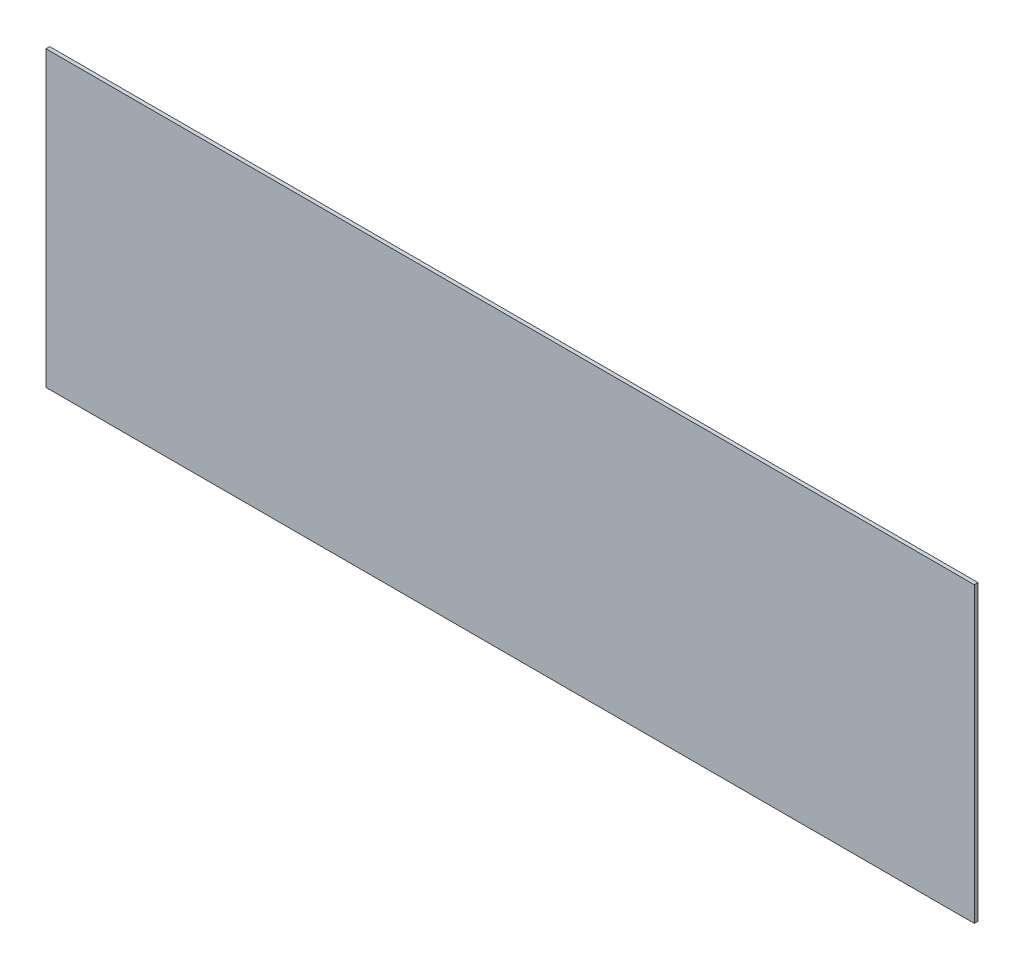
ISO-10303-21;
HEADER;
FILE_DESCRIPTION(('STEP AP214'),'2;1');
FILE_NAME('part.step','',(''),(''),'','','');
FILE_SCHEMA(('AUTOMOTIVE_DESIGN { 1 0 10303 214 1 1 1 1 }'));
ENDSEC;
DATA;
#1=APPLICATION_CONTEXT('core data for automotive mechanical design processes');
#2=APPLICATION_PROTOCOL_DEFINITION('international standard','automotive_design',2000,#1);
#3=PRODUCT_CONTEXT('',#1,'mechanical');
#4=PRODUCT('Part','Part','',(#3));
#5=PRODUCT_RELATED_PRODUCT_CATEGORY('part','',(#4));
#6=PRODUCT_DEFINITION_FORMATION('','',#4);
#7=PRODUCT_DEFINITION_CONTEXT('part definition',#1,'design');
#8=PRODUCT_DEFINITION('design','',#6,#7);
#9=PRODUCT_DEFINITION_SHAPE('','',#8);
#10=(LENGTH_UNIT() NAMED_UNIT(*) SI_UNIT(.MILLI.,.METRE.));
#11=(NAMED_UNIT(*) PLANE_ANGLE_UNIT() SI_UNIT($,.RADIAN.));
#12=(NAMED_UNIT(*) SI_UNIT($,.STERADIAN.) SOLID_ANGLE_UNIT());
#13=UNCERTAINTY_MEASURE_WITH_UNIT(LENGTH_MEASURE(1.E-05),#10,'distance_accuracy_value','');
#14=(GEOMETRIC_REPRESENTATION_CONTEXT(3) GLOBAL_UNCERTAINTY_ASSIGNED_CONTEXT((#13)) GLOBAL_UNIT_ASSIGNED_CONTEXT((#10,
#11,#12)) REPRESENTATION_CONTEXT('',''));
#15=CARTESIAN_POINT('',(0.,0.,0.));
#16=DIRECTION('',(0.,0.,1.));
#17=DIRECTION('',(1.,0.,0.));
#18=AXIS2_PLACEMENT_3D('',#15,#16,#17);
#19=CARTESIAN_POINT('',(-125.,-60.,151.));
#20=DIRECTION('',(1.,0.,0.));
#21=DIRECTION('',(0.,1.,0.));
#22=AXIS2_PLACEMENT_3D('',#19,#20,#21);
#23=PLANE('',#22);
#24=DIRECTION('',(0.,-1.,0.));
#25=VECTOR('',#24,1.);
#26=CARTESIAN_POINT('',(-125.,-60.,151.));
#27=LINE('',#26,#25);
#28=CARTESIAN_POINT('',(-125.,19.,151.));
#29=VERTEX_POINT('',#28);
#30=CARTESIAN_POINT('',(-125.,-60.,151.));
#31=VERTEX_POINT('',#30);
#32=EDGE_CURVE('E100',#29,#31,#27,.T.);
#33=ORIENTED_EDGE('',*,*,#32,.F.);
#34=DIRECTION('',(0.,0.,1.));
#35=VECTOR('',#34,1.);
#36=CARTESIAN_POINT('',(-125.,19.,141.));
#37=LINE('',#36,#35);
#38=CARTESIAN_POINT('',(-125.,19.,150.));
#39=VERTEX_POINT('',#38);
#40=EDGE_CURVE('E107',#39,#29,#37,.T.);
#41=ORIENTED_EDGE('',*,*,#40,.F.);
#42=DIRECTION('',(0.,-1.,0.));
#43=VECTOR('',#42,1.);
#44=CARTESIAN_POINT('',(-125.,-60.,150.));
#45=LINE('',#44,#43);
#46=CARTESIAN_POINT('',(-125.,-60.,150.));
#47=VERTEX_POINT('',#46);
#48=EDGE_CURVE('E92',#39,#47,#45,.T.);
#49=ORIENTED_EDGE('',*,*,#48,.T.);
#50=DIRECTION('',(0.,0.,-1.));
#51=VECTOR('',#50,1.);
#52=CARTESIAN_POINT('',(-125.,-60.,151.));
#53=LINE('',#52,#51);
#54=EDGE_CURVE('E54',#31,#47,#53,.T.);
#55=ORIENTED_EDGE('',*,*,#54,.F.);
#56=EDGE_LOOP('',(#33,#41,#49,#55));
#57=FACE_BOUND('',#56,.T.);
#58=ADVANCED_FACE('F47',(#57),#23,.F.);
#59=CARTESIAN_POINT('',(-125.,-60.,151.));
#60=DIRECTION('',(0.,1.,0.));
#61=DIRECTION('',(0.,0.,1.));
#62=AXIS2_PLACEMENT_3D('',#59,#60,#61);
#63=PLANE('',#62);
#64=DIRECTION('',(1.,0.,0.));
#65=VECTOR('',#64,1.);
#66=CARTESIAN_POINT('',(-125.,-60.,150.));
#67=LINE('',#66,#65);
#68=CARTESIAN_POINT('',(125.,-60.,150.));
#69=VERTEX_POINT('',#68);
#70=EDGE_CURVE('E82',#47,#69,#67,.T.);
#71=ORIENTED_EDGE('',*,*,#70,.T.);
#72=DIRECTION('',(0.,0.,-1.));
#73=VECTOR('',#72,1.);
#74=CARTESIAN_POINT('',(125.,-60.,151.));
#75=LINE('',#74,#73);
#76=CARTESIAN_POINT('',(125.,-60.,151.));
#77=VERTEX_POINT('',#76);
#78=EDGE_CURVE('E85',#77,#69,#75,.T.);
#79=ORIENTED_EDGE('',*,*,#78,.F.);
#80=DIRECTION('',(1.,0.,0.));
#81=VECTOR('',#80,1.);
#82=CARTESIAN_POINT('',(-125.,-60.,151.));
#83=LINE('',#82,#81);
#84=EDGE_CURVE('E69',#31,#77,#83,.T.);
#85=ORIENTED_EDGE('',*,*,#84,.F.);
#86=ORIENTED_EDGE('',*,*,#54,.T.);
#87=EDGE_LOOP('',(#71,#79,#85,#86));
#88=FACE_BOUND('',#87,.T.);
#89=ADVANCED_FACE('F84',(#88),#63,.F.);
#90=CARTESIAN_POINT('',(125.,-60.,151.));
#91=DIRECTION('',(-1.,0.,0.));
#92=DIRECTION('',(0.,0.,1.));
#93=AXIS2_PLACEMENT_3D('',#90,#91,#92);
#94=PLANE('',#93);
#95=DIRECTION('',(0.,1.,0.));
#96=VECTOR('',#95,1.);
#97=CARTESIAN_POINT('',(125.,-60.,150.));
#98=LINE('',#97,#96);
#99=CARTESIAN_POINT('',(125.,19.,150.));
#100=VERTEX_POINT('',#99);
#101=EDGE_CURVE('E91',#69,#100,#98,.T.);
#102=ORIENTED_EDGE('',*,*,#101,.T.);
#103=DIRECTION('',(0.,0.,1.));
#104=VECTOR('',#103,1.);
#105=CARTESIAN_POINT('',(125.,19.,141.));
#106=LINE('',#105,#104);
#107=CARTESIAN_POINT('',(125.,19.,151.));
#108=VERTEX_POINT('',#107);
#109=EDGE_CURVE('E60',#100,#108,#106,.T.);
#110=ORIENTED_EDGE('',*,*,#109,.T.);
#111=DIRECTION('',(0.,1.,0.));
#112=VECTOR('',#111,1.);
#113=CARTESIAN_POINT('',(125.,-60.,151.));
#114=LINE('',#113,#112);
#115=EDGE_CURVE('E97',#77,#108,#114,.T.);
#116=ORIENTED_EDGE('',*,*,#115,.F.);
#117=ORIENTED_EDGE('',*,*,#78,.T.);
#118=EDGE_LOOP('',(#102,#110,#116,#117));
#119=FACE_BOUND('',#118,.T.);
#120=ADVANCED_FACE('F96',(#119),#94,.F.);
#121=CARTESIAN_POINT('',(0.,0.,151.));
#122=DIRECTION('',(0.,0.,-1.));
#123=DIRECTION('',(-1.,0.,0.));
#124=AXIS2_PLACEMENT_3D('',#121,#122,#123);
#125=PLANE('',#124);
#126=ORIENTED_EDGE('',*,*,#115,.T.);
#127=DIRECTION('',(1.,0.,0.));
#128=VECTOR('',#127,1.);
#129=CARTESIAN_POINT('',(-125.,19.,151.));
#130=LINE('',#129,#128);
#131=EDGE_CURVE('E110',#29,#108,#130,.T.);
#132=ORIENTED_EDGE('',*,*,#131,.F.);
#133=ORIENTED_EDGE('',*,*,#32,.T.);
#134=ORIENTED_EDGE('',*,*,#84,.T.);
#135=EDGE_LOOP('',(#126,#132,#133,#134));
#136=FACE_BOUND('',#135,.T.);
#137=ADVANCED_FACE('F119',(#136),#125,.F.);
#138=CARTESIAN_POINT('',(0.,0.,150.));
#139=DIRECTION('',(0.,0.,-1.));
#140=DIRECTION('',(-1.,0.,0.));
#141=AXIS2_PLACEMENT_3D('',#138,#139,#140);
#142=PLANE('',#141);
#143=DIRECTION('',(-1.,0.,0.));
#144=VECTOR('',#143,1.);
#145=CARTESIAN_POINT('',(0.,19.,150.));
#146=LINE('',#145,#144);
#147=EDGE_CURVE('E11',#100,#39,#146,.T.);
#148=ORIENTED_EDGE('',*,*,#147,.F.);
#149=ORIENTED_EDGE('',*,*,#101,.F.);
#150=ORIENTED_EDGE('',*,*,#70,.F.);
#151=ORIENTED_EDGE('',*,*,#48,.F.);
#152=EDGE_LOOP('',(#148,#149,#150,#151));
#153=FACE_BOUND('',#152,.T.);
#154=ADVANCED_FACE('F99',(#153),#142,.T.);
#155=CARTESIAN_POINT('',(-125.,19.,141.));
#156=DIRECTION('',(0.,-1.,0.));
#157=DIRECTION('',(0.,0.,-1.));
#158=AXIS2_PLACEMENT_3D('',#155,#156,#157);
#159=PLANE('',#158);
#160=ORIENTED_EDGE('',*,*,#147,.T.);
#161=ORIENTED_EDGE('',*,*,#40,.T.);
#162=ORIENTED_EDGE('',*,*,#131,.T.);
#163=ORIENTED_EDGE('',*,*,#109,.F.);
#164=EDGE_LOOP('',(#160,#161,#162,#163));
#165=FACE_BOUND('',#164,.T.);
#166=ADVANCED_FACE('F114',(#165),#159,.F.);
#167=CLOSED_SHELL('',(#58,#89,#120,#137,#154,#166));
#168=MANIFOLD_SOLID_BREP('B2',#167);
#169=ADVANCED_BREP_SHAPE_REPRESENTATION('',(#18,#168),#14);
#170=SHAPE_DEFINITION_REPRESENTATION(#9,#169);
ENDSEC;
END-ISO-10303-21;
